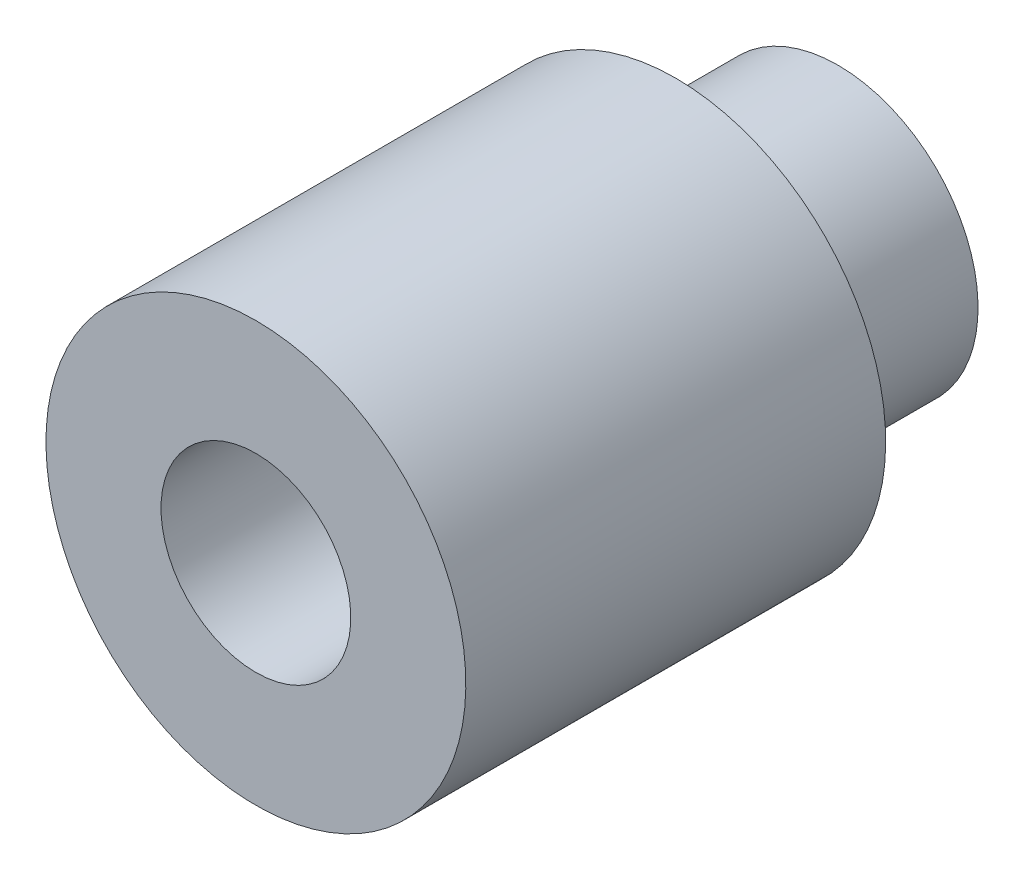
ISO-10303-21;
HEADER;
FILE_DESCRIPTION(('STEP AP214'),'2;1');
FILE_NAME('part.step','',(''),(''),'','','');
FILE_SCHEMA(('AUTOMOTIVE_DESIGN { 1 0 10303 214 1 1 1 1 }'));
ENDSEC;
DATA;
#1=APPLICATION_CONTEXT('core data for automotive mechanical design processes');
#2=APPLICATION_PROTOCOL_DEFINITION('international standard','automotive_design',2000,#1);
#3=PRODUCT_CONTEXT('',#1,'mechanical');
#4=PRODUCT('Part','Part','',(#3));
#5=PRODUCT_RELATED_PRODUCT_CATEGORY('part','',(#4));
#6=PRODUCT_DEFINITION_FORMATION('','',#4);
#7=PRODUCT_DEFINITION_CONTEXT('part definition',#1,'design');
#8=PRODUCT_DEFINITION('design','',#6,#7);
#9=PRODUCT_DEFINITION_SHAPE('','',#8);
#10=(LENGTH_UNIT() NAMED_UNIT(*) SI_UNIT(.MILLI.,.METRE.));
#11=(NAMED_UNIT(*) PLANE_ANGLE_UNIT() SI_UNIT($,.RADIAN.));
#12=(NAMED_UNIT(*) SI_UNIT($,.STERADIAN.) SOLID_ANGLE_UNIT());
#13=UNCERTAINTY_MEASURE_WITH_UNIT(LENGTH_MEASURE(1.E-05),#10,'distance_accuracy_value','');
#14=(GEOMETRIC_REPRESENTATION_CONTEXT(3) GLOBAL_UNCERTAINTY_ASSIGNED_CONTEXT((#13)) GLOBAL_UNIT_ASSIGNED_CONTEXT((#10,
#11,#12)) REPRESENTATION_CONTEXT('',''));
#15=CARTESIAN_POINT('',(0.,0.,0.));
#16=DIRECTION('',(0.,0.,1.));
#17=DIRECTION('',(1.,0.,0.));
#18=AXIS2_PLACEMENT_3D('',#15,#16,#17);
#19=CARTESIAN_POINT('',(0.,2.15265,0.));
#20=DIRECTION('',(0.,0.,1.));
#21=DIRECTION('',(0.,-1.,0.));
#22=AXIS2_PLACEMENT_3D('',#19,#20,#21);
#23=PLANE('',#22);
#24=CARTESIAN_POINT('',(0.,0.,0.));
#25=DIRECTION('',(0.,0.,-1.));
#26=DIRECTION('',(0.,1.,0.));
#27=AXIS2_PLACEMENT_3D('',#24,#25,#26);
#28=CIRCLE('',#27,2.15265);
#29=CARTESIAN_POINT('',(0.,2.15265,0.));
#30=VERTEX_POINT('',#29);
#31=EDGE_CURVE('E64',#30,#30,#28,.T.);
#32=ORIENTED_EDGE('',*,*,#31,.T.);
#33=EDGE_LOOP('',(#32));
#34=FACE_BOUND('',#33,.T.);
#35=CARTESIAN_POINT('',(0.,0.,0.));
#36=DIRECTION('',(0.,0.,-1.));
#37=DIRECTION('',(0.,1.,0.));
#38=AXIS2_PLACEMENT_3D('',#35,#36,#37);
#39=CIRCLE('',#38,4.7625);
#40=CARTESIAN_POINT('',(0.,4.7625,0.));
#41=VERTEX_POINT('',#40);
#42=EDGE_CURVE('E12',#41,#41,#39,.T.);
#43=ORIENTED_EDGE('',*,*,#42,.F.);
#44=EDGE_LOOP('',(#43));
#45=FACE_BOUND('',#44,.T.);
#46=ADVANCED_FACE('F42',(#34,#45),#23,.T.);
#47=CARTESIAN_POINT('',(0.,0.,0.));
#48=DIRECTION('',(0.,0.,-1.));
#49=DIRECTION('',(0.,1.,0.));
#50=AXIS2_PLACEMENT_3D('',#47,#48,#49);
#51=CYLINDRICAL_SURFACE('',#50,4.7625);
#52=ORIENTED_EDGE('',*,*,#42,.T.);
#53=EDGE_LOOP('',(#52));
#54=FACE_BOUND('',#53,.T.);
#55=CARTESIAN_POINT('',(0.,0.,-9.525));
#56=DIRECTION('',(0.,0.,-1.));
#57=DIRECTION('',(0.,1.,0.));
#58=AXIS2_PLACEMENT_3D('',#55,#56,#57);
#59=CIRCLE('',#58,4.7625);
#60=CARTESIAN_POINT('',(0.,4.7625,-9.525));
#61=VERTEX_POINT('',#60);
#62=EDGE_CURVE('E48',#61,#61,#59,.T.);
#63=ORIENTED_EDGE('',*,*,#62,.F.);
#64=EDGE_LOOP('',(#63));
#65=FACE_BOUND('',#64,.T.);
#66=ADVANCED_FACE('F82',(#54,#65),#51,.T.);
#67=CARTESIAN_POINT('',(0.,3.175,-9.525));
#68=DIRECTION('',(0.,0.,-1.));
#69=DIRECTION('',(0.,1.,0.));
#70=AXIS2_PLACEMENT_3D('',#67,#68,#69);
#71=PLANE('',#70);
#72=ORIENTED_EDGE('',*,*,#62,.T.);
#73=EDGE_LOOP('',(#72));
#74=FACE_BOUND('',#73,.T.);
#75=CARTESIAN_POINT('',(0.,0.,-9.525));
#76=DIRECTION('',(0.,0.,-1.));
#77=DIRECTION('',(0.,1.,0.));
#78=AXIS2_PLACEMENT_3D('',#75,#76,#77);
#79=CIRCLE('',#78,3.175);
#80=CARTESIAN_POINT('',(0.,3.175,-9.525));
#81=VERTEX_POINT('',#80);
#82=EDGE_CURVE('E52',#81,#81,#79,.T.);
#83=ORIENTED_EDGE('',*,*,#82,.F.);
#84=EDGE_LOOP('',(#83));
#85=FACE_BOUND('',#84,.T.);
#86=ADVANCED_FACE('F86',(#74,#85),#71,.T.);
#87=CARTESIAN_POINT('',(0.,0.,0.));
#88=DIRECTION('',(0.,0.,-1.));
#89=DIRECTION('',(0.,1.,0.));
#90=AXIS2_PLACEMENT_3D('',#87,#88,#89);
#91=CYLINDRICAL_SURFACE('',#90,3.175);
#92=ORIENTED_EDGE('',*,*,#82,.T.);
#93=EDGE_LOOP('',(#92));
#94=FACE_BOUND('',#93,.T.);
#95=CARTESIAN_POINT('',(0.,0.,-13.208));
#96=DIRECTION('',(0.,0.,-1.));
#97=DIRECTION('',(0.,1.,0.));
#98=AXIS2_PLACEMENT_3D('',#95,#96,#97);
#99=CIRCLE('',#98,3.175);
#100=CARTESIAN_POINT('',(0.,3.175,-13.208));
#101=VERTEX_POINT('',#100);
#102=EDGE_CURVE('E56',#101,#101,#99,.T.);
#103=ORIENTED_EDGE('',*,*,#102,.F.);
#104=EDGE_LOOP('',(#103));
#105=FACE_BOUND('',#104,.T.);
#106=ADVANCED_FACE('F78',(#94,#105),#91,.T.);
#107=CARTESIAN_POINT('',(0.,2.15265,-13.208));
#108=DIRECTION('',(0.,0.,-1.));
#109=DIRECTION('',(0.,1.,0.));
#110=AXIS2_PLACEMENT_3D('',#107,#108,#109);
#111=PLANE('',#110);
#112=ORIENTED_EDGE('',*,*,#102,.T.);
#113=EDGE_LOOP('',(#112));
#114=FACE_BOUND('',#113,.T.);
#115=CARTESIAN_POINT('',(0.,0.,-13.208));
#116=DIRECTION('',(0.,0.,-1.));
#117=DIRECTION('',(0.,1.,0.));
#118=AXIS2_PLACEMENT_3D('',#115,#116,#117);
#119=CIRCLE('',#118,2.15265);
#120=CARTESIAN_POINT('',(0.,2.15265,-13.208));
#121=VERTEX_POINT('',#120);
#122=EDGE_CURVE('E61',#121,#121,#119,.T.);
#123=ORIENTED_EDGE('',*,*,#122,.F.);
#124=EDGE_LOOP('',(#123));
#125=FACE_BOUND('',#124,.T.);
#126=ADVANCED_FACE('F72',(#114,#125),#111,.T.);
#127=CARTESIAN_POINT('',(0.,0.,0.));
#128=DIRECTION('',(0.,0.,-1.));
#129=DIRECTION('',(0.,1.,0.));
#130=AXIS2_PLACEMENT_3D('',#127,#128,#129);
#131=CYLINDRICAL_SURFACE('',#130,2.15265);
#132=ORIENTED_EDGE('',*,*,#122,.T.);
#133=EDGE_LOOP('',(#132));
#134=FACE_BOUND('',#133,.T.);
#135=ORIENTED_EDGE('',*,*,#31,.F.);
#136=EDGE_LOOP('',(#135));
#137=FACE_BOUND('',#136,.T.);
#138=ADVANCED_FACE('F70',(#134,#137),#131,.F.);
#139=CLOSED_SHELL('',(#46,#66,#86,#106,#126,#138));
#140=MANIFOLD_SOLID_BREP('B2',#139);
#141=ADVANCED_BREP_SHAPE_REPRESENTATION('',(#18,#140),#14);
#142=SHAPE_DEFINITION_REPRESENTATION(#9,#141);
ENDSEC;
END-ISO-10303-21;
